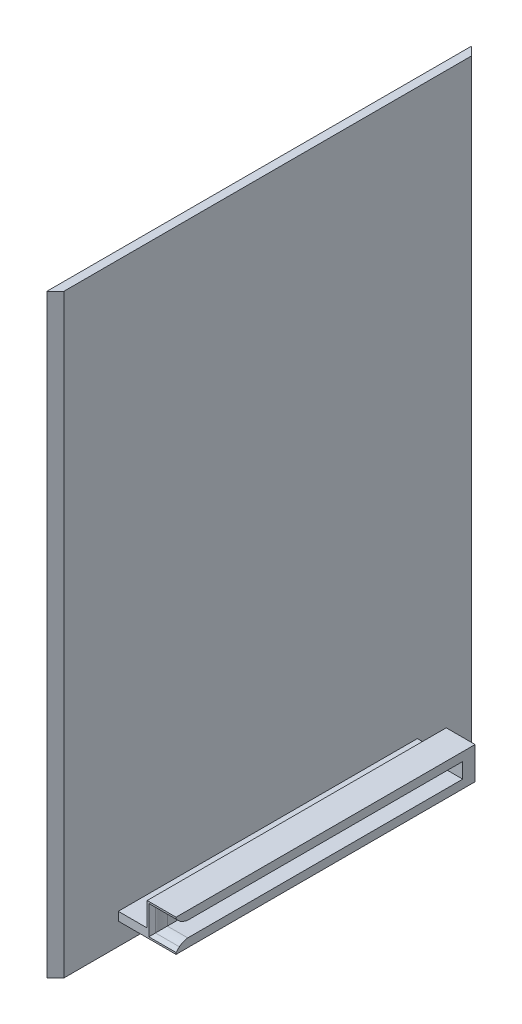
ISO-10303-21;
HEADER;
FILE_DESCRIPTION(('STEP AP214'),'2;1');
FILE_NAME('part.step','',(''),(''),'','','');
FILE_SCHEMA(('AUTOMOTIVE_DESIGN { 1 0 10303 214 1 1 1 1 }'));
ENDSEC;
DATA;
#1=APPLICATION_CONTEXT('core data for automotive mechanical design processes');
#2=APPLICATION_PROTOCOL_DEFINITION('international standard','automotive_design',2000,#1);
#3=PRODUCT_CONTEXT('',#1,'mechanical');
#4=PRODUCT('Part','Part','',(#3));
#5=PRODUCT_RELATED_PRODUCT_CATEGORY('part','',(#4));
#6=PRODUCT_DEFINITION_FORMATION('','',#4);
#7=PRODUCT_DEFINITION_CONTEXT('part definition',#1,'design');
#8=PRODUCT_DEFINITION('design','',#6,#7);
#9=PRODUCT_DEFINITION_SHAPE('','',#8);
#10=(LENGTH_UNIT() NAMED_UNIT(*) SI_UNIT(.MILLI.,.METRE.));
#11=(NAMED_UNIT(*) PLANE_ANGLE_UNIT() SI_UNIT($,.RADIAN.));
#12=(NAMED_UNIT(*) SI_UNIT($,.STERADIAN.) SOLID_ANGLE_UNIT());
#13=UNCERTAINTY_MEASURE_WITH_UNIT(LENGTH_MEASURE(1.E-05),#10,'distance_accuracy_value','');
#14=(GEOMETRIC_REPRESENTATION_CONTEXT(3) GLOBAL_UNCERTAINTY_ASSIGNED_CONTEXT((#13)) GLOBAL_UNIT_ASSIGNED_CONTEXT((#10,
#11,#12)) REPRESENTATION_CONTEXT('',''));
#15=CARTESIAN_POINT('',(0.,0.,0.));
#16=DIRECTION('',(0.,0.,1.));
#17=DIRECTION('',(1.,0.,0.));
#18=AXIS2_PLACEMENT_3D('',#15,#16,#17);
#19=CARTESIAN_POINT('',(34.,18.,-37.));
#20=DIRECTION('',(0.,-1.,0.));
#21=DIRECTION('',(0.,0.,-1.));
#22=AXIS2_PLACEMENT_3D('',#19,#20,#21);
#23=PLANE('',#22);
#24=DIRECTION('',(1.,0.,0.));
#25=VECTOR('',#24,1.);
#26=CARTESIAN_POINT('',(34.,18.,-205.7));
#27=LINE('',#26,#25);
#28=CARTESIAN_POINT('',(22.,18.,-205.7));
#29=VERTEX_POINT('',#28);
#30=CARTESIAN_POINT('',(34.,18.,-205.7));
#31=VERTEX_POINT('',#30);
#32=EDGE_CURVE('E73',#29,#31,#27,.T.);
#33=ORIENTED_EDGE('',*,*,#32,.F.);
#34=DIRECTION('',(0.,0.,-1.));
#35=VECTOR('',#34,1.);
#36=CARTESIAN_POINT('',(22.,18.,-213.));
#37=LINE('',#36,#35);
#38=CARTESIAN_POINT('',(22.,18.,-43.8994949366117));
#39=VERTEX_POINT('',#38);
#40=EDGE_CURVE('E189',#39,#29,#37,.T.);
#41=ORIENTED_EDGE('',*,*,#40,.F.);
#42=CARTESIAN_POINT('',(34.7025126265847,18.,-43.8994949366117));
#43=CARTESIAN_POINT('',(29.5507533649635,18.,-43.8994949366117));
#44=CARTESIAN_POINT('',(24.3989941033423,18.,-43.8994949366117));
#45=CARTESIAN_POINT('',(19.2472348417211,18.,-43.8994949366117));
#46=(BOUNDED_CURVE() B_SPLINE_CURVE(3,(#42,#43,#44,#45),.UNSPECIFIED.,.F.,
.F.) B_SPLINE_CURVE_WITH_KNOTS((4,4),(-0.0147527651582789,0.000702512626584707),
.UNSPECIFIED.) CURVE() GEOMETRIC_REPRESENTATION_ITEM() RATIONAL_B_SPLINE_CURVE((1.,1.,1.,1.)) REPRESENTATION_ITEM(''));
#47=CARTESIAN_POINT('',(34.,18.,-43.8994949366117));
#48=VERTEX_POINT('',#47);
#49=EDGE_CURVE('E406',#39,#48,#46,.F.);
#50=ORIENTED_EDGE('',*,*,#49,.T.);
#51=DIRECTION('',(0.,0.,1.));
#52=VECTOR('',#51,1.);
#53=CARTESIAN_POINT('',(34.,18.,-37.));
#54=LINE('',#53,#52);
#55=EDGE_CURVE('E68',#31,#48,#54,.T.);
#56=ORIENTED_EDGE('',*,*,#55,.F.);
#57=EDGE_LOOP('',(#33,#41,#50,#56));
#58=FACE_BOUND('',#57,.T.);
#59=ADVANCED_FACE('F46',(#58),#23,.F.);
#60=CARTESIAN_POINT('',(22.,27.,-213.));
#61=DIRECTION('',(-1.,0.,0.));
#62=DIRECTION('',(0.,0.,1.));
#63=AXIS2_PLACEMENT_3D('',#60,#61,#62);
#64=PLANE('',#63);
#65=DIRECTION('',(0.,-1.,0.));
#66=VECTOR('',#65,1.);
#67=CARTESIAN_POINT('',(22.,27.,-205.7));
#68=LINE('',#67,#66);
#69=CARTESIAN_POINT('',(22.,27.,-205.7));
#70=VERTEX_POINT('',#69);
#71=EDGE_CURVE('E192',#70,#29,#68,.T.);
#72=ORIENTED_EDGE('',*,*,#71,.F.);
#73=DIRECTION('',(0.,0.,-1.));
#74=VECTOR('',#73,1.);
#75=CARTESIAN_POINT('',(22.,27.,-213.));
#76=LINE('',#75,#74);
#77=CARTESIAN_POINT('',(22.,27.,-43.8994949366117));
#78=VERTEX_POINT('',#77);
#79=EDGE_CURVE('E176',#78,#70,#76,.T.);
#80=ORIENTED_EDGE('',*,*,#79,.F.);
#81=CARTESIAN_POINT('',(22.,15.2947222151364,-43.8994949366117));
#82=CARTESIAN_POINT('',(22.,20.0982407383788,-43.8994949366117));
#83=CARTESIAN_POINT('',(22.,24.9017592616213,-43.8994949366117));
#84=CARTESIAN_POINT('',(22.,29.7052777848636,-43.8994949366117));
#85=(BOUNDED_CURVE() B_SPLINE_CURVE(3,(#81,#82,#83,#84),.UNSPECIFIED.,.F.,
.F.) B_SPLINE_CURVE_WITH_KNOTS((4,4),(-0.00270527778486359,0.0117052777848636),
.UNSPECIFIED.) CURVE() GEOMETRIC_REPRESENTATION_ITEM() RATIONAL_B_SPLINE_CURVE((1.,1.,1.,1.)) REPRESENTATION_ITEM(''));
#86=EDGE_CURVE('E339',#78,#39,#85,.F.);
#87=ORIENTED_EDGE('',*,*,#86,.T.);
#88=ORIENTED_EDGE('',*,*,#40,.T.);
#89=EDGE_LOOP('',(#72,#80,#87,#88));
#90=FACE_BOUND('',#89,.T.);
#91=ADVANCED_FACE('F193',(#90),#64,.F.);
#92=CARTESIAN_POINT('',(0.,27.,0.));
#93=DIRECTION('',(0.,1.,0.));
#94=DIRECTION('',(0.,0.,1.));
#95=AXIS2_PLACEMENT_3D('',#92,#93,#94);
#96=PLANE('',#95);
#97=DIRECTION('',(-1.,0.,0.));
#98=VECTOR('',#97,1.);
#99=CARTESIAN_POINT('',(0.,27.,-205.7));
#100=LINE('',#99,#98);
#101=CARTESIAN_POINT('',(34.,27.,-205.7));
#102=VERTEX_POINT('',#101);
#103=EDGE_CURVE('E181',#102,#70,#100,.T.);
#104=ORIENTED_EDGE('',*,*,#103,.F.);
#105=DIRECTION('',(0.,0.,-1.));
#106=VECTOR('',#105,1.);
#107=CARTESIAN_POINT('',(34.,27.,-213.));
#108=LINE('',#107,#106);
#109=CARTESIAN_POINT('',(34.,27.,-43.8994949366117));
#110=VERTEX_POINT('',#109);
#111=EDGE_CURVE('E208',#110,#102,#108,.T.);
#112=ORIENTED_EDGE('',*,*,#111,.F.);
#113=CARTESIAN_POINT('',(19.2472348417212,27.,-43.8994949366117));
#114=CARTESIAN_POINT('',(24.3989941033424,27.,-43.8994949366117));
#115=CARTESIAN_POINT('',(29.5507533649635,27.,-43.8994949366117));
#116=CARTESIAN_POINT('',(34.7025126265847,27.,-43.8994949366117));
#117=(BOUNDED_CURVE() B_SPLINE_CURVE(3,(#113,#114,#115,#116),.UNSPECIFIED.,.F.,
.F.) B_SPLINE_CURVE_WITH_KNOTS((4,4),(-0.0347025126265847,-0.0192472348417212),
.UNSPECIFIED.) CURVE() GEOMETRIC_REPRESENTATION_ITEM() RATIONAL_B_SPLINE_CURVE((1.,1.,1.,1.)) REPRESENTATION_ITEM(''));
#118=EDGE_CURVE('E184',#110,#78,#117,.F.);
#119=ORIENTED_EDGE('',*,*,#118,.T.);
#120=ORIENTED_EDGE('',*,*,#79,.T.);
#121=EDGE_LOOP('',(#104,#112,#119,#120));
#122=FACE_BOUND('',#121,.T.);
#123=ADVANCED_FACE('F178',(#122),#96,.F.);
#124=DIRECTION('',(0.,0.,1.));
#125=VECTOR('',#124,1.);
#126=CARTESIAN_POINT('',(17.,18.,-213.));
#127=LINE('',#126,#125);
#128=CARTESIAN_POINT('',(17.,18.,-213.));
#129=VERTEX_POINT('',#128);
#130=CARTESIAN_POINT('',(17.,18.,-37.));
#131=VERTEX_POINT('',#130);
#132=EDGE_CURVE('E269',#129,#131,#127,.T.);
#133=ORIENTED_EDGE('',*,*,#132,.F.);
#134=DIRECTION('',(-1.,0.,0.));
#135=VECTOR('',#134,1.);
#136=CARTESIAN_POINT('',(34.,18.,-213.));
#137=LINE('',#136,#135);
#138=CARTESIAN_POINT('',(0.,18.,-213.));
#139=VERTEX_POINT('',#138);
#140=EDGE_CURVE('E463',#129,#139,#137,.T.);
#141=ORIENTED_EDGE('',*,*,#140,.T.);
#142=DIRECTION('',(0.,0.,1.));
#143=VECTOR('',#142,1.);
#144=CARTESIAN_POINT('',(0.,18.,-37.));
#145=LINE('',#144,#143);
#146=CARTESIAN_POINT('',(0.,18.,-37.));
#147=VERTEX_POINT('',#146);
#148=EDGE_CURVE('E283',#139,#147,#145,.T.);
#149=ORIENTED_EDGE('',*,*,#148,.T.);
#150=DIRECTION('',(-1.,0.,0.));
#151=VECTOR('',#150,1.);
#152=CARTESIAN_POINT('',(34.,18.,-37.));
#153=LINE('',#152,#151);
#154=EDGE_CURVE('E292',#131,#147,#153,.T.);
#155=ORIENTED_EDGE('',*,*,#154,.F.);
#156=EDGE_LOOP('',(#133,#141,#149,#155));
#157=FACE_BOUND('',#156,.T.);
#158=ADVANCED_FACE('F244',(#157),#23,.F.);
#159=CARTESIAN_POINT('',(0.,350.,0.));
#160=DIRECTION('',(-1.,0.,0.));
#161=DIRECTION('',(0.,0.,1.));
#162=AXIS2_PLACEMENT_3D('',#159,#160,#161);
#163=PLANE('',#162);
#164=DIRECTION('',(0.,0.,-1.));
#165=VECTOR('',#164,1.);
#166=CARTESIAN_POINT('',(0.,0.,0.));
#167=LINE('',#166,#165);
#168=CARTESIAN_POINT('',(0.,0.,-5.));
#169=VERTEX_POINT('',#168);
#170=CARTESIAN_POINT('',(0.,0.,-245.));
#171=VERTEX_POINT('',#170);
#172=EDGE_CURVE('E437',#169,#171,#167,.T.);
#173=ORIENTED_EDGE('',*,*,#172,.T.);
#174=DIRECTION('',(0.,1.,0.));
#175=VECTOR('',#174,1.);
#176=CARTESIAN_POINT('',(0.,-0.000999999999973245,-245.));
#177=LINE('',#176,#175);
#178=CARTESIAN_POINT('',(0.,350.,-245.));
#179=VERTEX_POINT('',#178);
#180=EDGE_CURVE('E454',#171,#179,#177,.T.);
#181=ORIENTED_EDGE('',*,*,#180,.T.);
#182=DIRECTION('',(0.,0.,-1.));
#183=VECTOR('',#182,1.);
#184=CARTESIAN_POINT('',(0.,350.,0.));
#185=LINE('',#184,#183);
#186=CARTESIAN_POINT('',(0.,350.,-5.));
#187=VERTEX_POINT('',#186);
#188=EDGE_CURVE('E436',#187,#179,#185,.T.);
#189=ORIENTED_EDGE('',*,*,#188,.F.);
#190=DIRECTION('',(0.,1.,0.));
#191=VECTOR('',#190,1.);
#192=CARTESIAN_POINT('',(0.,-0.000999999999973245,-5.));
#193=LINE('',#192,#191);
#194=EDGE_CURVE('E445',#169,#187,#193,.T.);
#195=ORIENTED_EDGE('',*,*,#194,.F.);
#196=EDGE_LOOP('',(#173,#181,#189,#195));
#197=FACE_BOUND('',#196,.T.);
#198=DIRECTION('',(0.,-1.,0.));
#199=VECTOR('',#198,1.);
#200=CARTESIAN_POINT('',(0.,13.,-37.));
#201=LINE('',#200,#199);
#202=CARTESIAN_POINT('',(0.,13.,-37.));
#203=VERTEX_POINT('',#202);
#204=EDGE_CURVE('E279',#147,#203,#201,.T.);
#205=ORIENTED_EDGE('',*,*,#204,.F.);
#206=ORIENTED_EDGE('',*,*,#148,.F.);
#207=DIRECTION('',(0.,1.,0.));
#208=VECTOR('',#207,1.);
#209=CARTESIAN_POINT('',(0.,13.,-213.));
#210=LINE('',#209,#208);
#211=CARTESIAN_POINT('',(0.,13.,-213.));
#212=VERTEX_POINT('',#211);
#213=EDGE_CURVE('E468',#212,#139,#210,.T.);
#214=ORIENTED_EDGE('',*,*,#213,.F.);
#215=DIRECTION('',(0.,0.,-1.));
#216=VECTOR('',#215,1.);
#217=CARTESIAN_POINT('',(0.,13.,-37.));
#218=LINE('',#217,#216);
#219=EDGE_CURVE('E470',#203,#212,#218,.T.);
#220=ORIENTED_EDGE('',*,*,#219,.F.);
#221=EDGE_LOOP('',(#205,#206,#214,#220));
#222=FACE_BOUND('',#221,.T.);
#223=ADVANCED_FACE('F481',(#197,#222),#163,.F.);
#224=CARTESIAN_POINT('',(-5.,350.,-250.));
#225=DIRECTION('',(1.,0.,0.));
#226=DIRECTION('',(0.,0.,-1.));
#227=AXIS2_PLACEMENT_3D('',#224,#225,#226);
#228=PLANE('',#227);
#229=DIRECTION('',(0.,0.,1.));
#230=VECTOR('',#229,1.);
#231=CARTESIAN_POINT('',(-5.,0.,-250.));
#232=LINE('',#231,#230);
#233=CARTESIAN_POINT('',(-5.,0.,-250.));
#234=VERTEX_POINT('',#233);
#235=CARTESIAN_POINT('',(-4.99999999999997,0.,0.));
#236=VERTEX_POINT('',#235);
#237=EDGE_CURVE('E433',#234,#236,#232,.T.);
#238=ORIENTED_EDGE('',*,*,#237,.T.);
#239=DIRECTION('',(0.,-1.,0.));
#240=VECTOR('',#239,1.);
#241=CARTESIAN_POINT('',(-4.99999999999997,350.,0.));
#242=LINE('',#241,#240);
#243=CARTESIAN_POINT('',(-4.99999999999997,350.,0.));
#244=VERTEX_POINT('',#243);
#245=EDGE_CURVE('E430',#244,#236,#242,.T.);
#246=ORIENTED_EDGE('',*,*,#245,.F.);
#247=DIRECTION('',(0.,0.,1.));
#248=VECTOR('',#247,1.);
#249=CARTESIAN_POINT('',(-5.,350.,-250.));
#250=LINE('',#249,#248);
#251=CARTESIAN_POINT('',(-5.,350.,-250.));
#252=VERTEX_POINT('',#251);
#253=EDGE_CURVE('E432',#252,#244,#250,.T.);
#254=ORIENTED_EDGE('',*,*,#253,.F.);
#255=DIRECTION('',(0.,-1.,0.));
#256=VECTOR('',#255,1.);
#257=CARTESIAN_POINT('',(-5.,350.,-250.));
#258=LINE('',#257,#256);
#259=EDGE_CURVE('E427',#252,#234,#258,.T.);
#260=ORIENTED_EDGE('',*,*,#259,.T.);
#261=EDGE_LOOP('',(#238,#246,#254,#260));
#262=FACE_BOUND('',#261,.T.);
#263=ADVANCED_FACE('F522',(#262),#228,.F.);
#264=CARTESIAN_POINT('',(0.,350.,0.));
#265=DIRECTION('',(0.,1.,0.));
#266=DIRECTION('',(0.,0.,1.));
#267=AXIS2_PLACEMENT_3D('',#264,#265,#266);
#268=PLANE('',#267);
#269=DIRECTION('',(0.707106781186547,0.,0.707106781186548));
#270=VECTOR('',#269,1.);
#271=CARTESIAN_POINT('',(0.,350.,-245.));
#272=LINE('',#271,#270);
#273=EDGE_CURVE('E447',#252,#179,#272,.T.);
#274=ORIENTED_EDGE('',*,*,#273,.F.);
#275=ORIENTED_EDGE('',*,*,#253,.T.);
#276=DIRECTION('',(-0.707106781186545,0.,0.70710678118655));
#277=VECTOR('',#276,1.);
#278=CARTESIAN_POINT('',(-4.99999999999997,350.,0.));
#279=LINE('',#278,#277);
#280=EDGE_CURVE('E448',#187,#244,#279,.T.);
#281=ORIENTED_EDGE('',*,*,#280,.F.);
#282=ORIENTED_EDGE('',*,*,#188,.T.);
#283=EDGE_LOOP('',(#274,#275,#281,#282));
#284=FACE_BOUND('',#283,.T.);
#285=ADVANCED_FACE('F529',(#284),#268,.T.);
#286=CARTESIAN_POINT('',(0.,0.,0.));
#287=DIRECTION('',(0.,1.,0.));
#288=DIRECTION('',(0.,0.,1.));
#289=AXIS2_PLACEMENT_3D('',#286,#287,#288);
#290=PLANE('',#289);
#291=ORIENTED_EDGE('',*,*,#237,.F.);
#292=DIRECTION('',(-0.707106781186547,0.,-0.707106781186548));
#293=VECTOR('',#292,1.);
#294=CARTESIAN_POINT('',(0.,0.,-245.));
#295=LINE('',#294,#293);
#296=EDGE_CURVE('E440',#171,#234,#295,.T.);
#297=ORIENTED_EDGE('',*,*,#296,.F.);
#298=ORIENTED_EDGE('',*,*,#172,.F.);
#299=DIRECTION('',(0.707106781186545,0.,-0.70710678118655));
#300=VECTOR('',#299,1.);
#301=CARTESIAN_POINT('',(-4.99999999999997,0.,0.));
#302=LINE('',#301,#300);
#303=EDGE_CURVE('E450',#236,#169,#302,.T.);
#304=ORIENTED_EDGE('',*,*,#303,.F.);
#305=EDGE_LOOP('',(#291,#297,#298,#304));
#306=FACE_BOUND('',#305,.T.);
#307=ADVANCED_FACE('F576',(#306),#290,.F.);
#308=CARTESIAN_POINT('',(-4.99999999999997,-0.000999999999973245,0.));
#309=DIRECTION('',(-0.70710678118655,0.,-0.707106781186545));
#310=DIRECTION('',(-0.707106781186545,0.,0.70710678118655));
#311=AXIS2_PLACEMENT_3D('',#308,#309,#310);
#312=PLANE('',#311);
#313=ORIENTED_EDGE('',*,*,#303,.T.);
#314=ORIENTED_EDGE('',*,*,#194,.T.);
#315=ORIENTED_EDGE('',*,*,#280,.T.);
#316=ORIENTED_EDGE('',*,*,#245,.T.);
#317=EDGE_LOOP('',(#313,#314,#315,#316));
#318=FACE_BOUND('',#317,.T.);
#319=ADVANCED_FACE('F572',(#318),#312,.F.);
#320=CARTESIAN_POINT('',(0.,-0.000999999999973245,-245.));
#321=DIRECTION('',(-0.707106781186548,0.,0.707106781186547));
#322=DIRECTION('',(0.707106781186547,0.,0.707106781186548));
#323=AXIS2_PLACEMENT_3D('',#320,#321,#322);
#324=PLANE('',#323);
#325=ORIENTED_EDGE('',*,*,#296,.T.);
#326=ORIENTED_EDGE('',*,*,#259,.F.);
#327=ORIENTED_EDGE('',*,*,#273,.T.);
#328=ORIENTED_EDGE('',*,*,#180,.F.);
#329=EDGE_LOOP('',(#325,#326,#327,#328));
#330=FACE_BOUND('',#329,.T.);
#331=ADVANCED_FACE('F570',(#330),#324,.F.);
#332=CARTESIAN_POINT('',(34.,13.,-37.));
#333=DIRECTION('',(0.,0.,-1.));
#334=DIRECTION('',(-1.,0.,0.));
#335=AXIS2_PLACEMENT_3D('',#332,#333,#334);
#336=PLANE('',#335);
#337=DIRECTION('',(0.,-1.,0.));
#338=VECTOR('',#337,1.);
#339=CARTESIAN_POINT('',(34.,13.,-37.));
#340=LINE('',#339,#338);
#341=CARTESIAN_POINT('',(34.,14.,-37.));
#342=VERTEX_POINT('',#341);
#343=CARTESIAN_POINT('',(34.,13.,-37.));
#344=VERTEX_POINT('',#343);
#345=EDGE_CURVE('E280',#342,#344,#340,.T.);
#346=ORIENTED_EDGE('',*,*,#345,.F.);
#347=DIRECTION('',(-1.,0.,0.));
#348=VECTOR('',#347,1.);
#349=CARTESIAN_POINT('',(34.,14.,-37.));
#350=LINE('',#349,#348);
#351=CARTESIAN_POINT('',(18.,14.,-37.));
#352=VERTEX_POINT('',#351);
#353=EDGE_CURVE('E409',#342,#352,#350,.T.);
#354=ORIENTED_EDGE('',*,*,#353,.T.);
#355=DIRECTION('',(0.,1.,0.));
#356=VECTOR('',#355,1.);
#357=CARTESIAN_POINT('',(18.,13.,-37.));
#358=LINE('',#357,#356);
#359=CARTESIAN_POINT('',(18.,31.,-37.));
#360=VERTEX_POINT('',#359);
#361=EDGE_CURVE('E413',#352,#360,#358,.T.);
#362=ORIENTED_EDGE('',*,*,#361,.T.);
#363=DIRECTION('',(1.,0.,0.));
#364=VECTOR('',#363,1.);
#365=CARTESIAN_POINT('',(34.,31.,-37.));
#366=LINE('',#365,#364);
#367=CARTESIAN_POINT('',(34.,31.,-37.));
#368=VERTEX_POINT('',#367);
#369=EDGE_CURVE('E425',#360,#368,#366,.T.);
#370=ORIENTED_EDGE('',*,*,#369,.T.);
#371=DIRECTION('',(0.,-1.,0.));
#372=VECTOR('',#371,1.);
#373=CARTESIAN_POINT('',(34.,32.,-37.));
#374=LINE('',#373,#372);
#375=CARTESIAN_POINT('',(34.,32.,-37.));
#376=VERTEX_POINT('',#375);
#377=EDGE_CURVE('E216',#376,#368,#374,.T.);
#378=ORIENTED_EDGE('',*,*,#377,.F.);
#379=DIRECTION('',(1.,0.,0.));
#380=VECTOR('',#379,1.);
#381=CARTESIAN_POINT('',(17.,32.,-37.));
#382=LINE('',#381,#380);
#383=CARTESIAN_POINT('',(17.,32.,-37.));
#384=VERTEX_POINT('',#383);
#385=EDGE_CURVE('E207',#384,#376,#382,.T.);
#386=ORIENTED_EDGE('',*,*,#385,.F.);
#387=DIRECTION('',(0.,-1.,0.));
#388=VECTOR('',#387,1.);
#389=CARTESIAN_POINT('',(17.,27.,-37.));
#390=LINE('',#389,#388);
#391=EDGE_CURVE('E276',#384,#131,#390,.T.);
#392=ORIENTED_EDGE('',*,*,#391,.T.);
#393=ORIENTED_EDGE('',*,*,#154,.T.);
#394=ORIENTED_EDGE('',*,*,#204,.T.);
#395=DIRECTION('',(-1.,0.,0.));
#396=VECTOR('',#395,1.);
#397=CARTESIAN_POINT('',(34.,13.,-37.));
#398=LINE('',#397,#396);
#399=EDGE_CURVE('E452',#344,#203,#398,.T.);
#400=ORIENTED_EDGE('',*,*,#399,.F.);
#401=EDGE_LOOP('',(#346,#354,#362,#370,#378,#386,#392,#393,#394,#400));
#402=FACE_BOUND('',#401,.T.);
#403=ADVANCED_FACE('F478',(#402),#336,.F.);
#404=CARTESIAN_POINT('',(34.,13.,-37.));
#405=DIRECTION('',(0.,1.,0.));
#406=DIRECTION('',(0.,0.,1.));
#407=AXIS2_PLACEMENT_3D('',#404,#405,#406);
#408=PLANE('',#407);
#409=ORIENTED_EDGE('',*,*,#219,.T.);
#410=DIRECTION('',(-1.,0.,0.));
#411=VECTOR('',#410,1.);
#412=CARTESIAN_POINT('',(34.,13.,-213.));
#413=LINE('',#412,#411);
#414=CARTESIAN_POINT('',(34.,13.,-213.));
#415=VERTEX_POINT('',#414);
#416=EDGE_CURVE('E460',#415,#212,#413,.T.);
#417=ORIENTED_EDGE('',*,*,#416,.F.);
#418=DIRECTION('',(0.,0.,-1.));
#419=VECTOR('',#418,1.);
#420=CARTESIAN_POINT('',(34.,13.,-37.));
#421=LINE('',#420,#419);
#422=EDGE_CURVE('E282',#344,#415,#421,.T.);
#423=ORIENTED_EDGE('',*,*,#422,.F.);
#424=ORIENTED_EDGE('',*,*,#399,.T.);
#425=EDGE_LOOP('',(#409,#417,#423,#424));
#426=FACE_BOUND('',#425,.T.);
#427=ADVANCED_FACE('F490',(#426),#408,.F.);
#428=CARTESIAN_POINT('',(34.,13.,-213.));
#429=DIRECTION('',(0.,0.,1.));
#430=DIRECTION('',(1.,0.,0.));
#431=AXIS2_PLACEMENT_3D('',#428,#429,#430);
#432=PLANE('',#431);
#433=DIRECTION('',(-1.,0.,0.));
#434=VECTOR('',#433,1.);
#435=CARTESIAN_POINT('',(17.,32.,-213.));
#436=LINE('',#435,#434);
#437=CARTESIAN_POINT('',(34.,32.,-213.));
#438=VERTEX_POINT('',#437);
#439=CARTESIAN_POINT('',(17.,32.,-213.));
#440=VERTEX_POINT('',#439);
#441=EDGE_CURVE('E213',#438,#440,#436,.T.);
#442=ORIENTED_EDGE('',*,*,#441,.F.);
#443=DIRECTION('',(0.,1.,0.));
#444=VECTOR('',#443,1.);
#445=CARTESIAN_POINT('',(34.,13.,-213.));
#446=LINE('',#445,#444);
#447=EDGE_CURVE('E285',#415,#438,#446,.T.);
#448=ORIENTED_EDGE('',*,*,#447,.F.);
#449=ORIENTED_EDGE('',*,*,#416,.T.);
#450=ORIENTED_EDGE('',*,*,#213,.T.);
#451=ORIENTED_EDGE('',*,*,#140,.F.);
#452=DIRECTION('',(0.,-1.,0.));
#453=VECTOR('',#452,1.);
#454=CARTESIAN_POINT('',(17.,27.,-213.));
#455=LINE('',#454,#453);
#456=EDGE_CURVE('E188',#440,#129,#455,.T.);
#457=ORIENTED_EDGE('',*,*,#456,.F.);
#458=EDGE_LOOP('',(#442,#448,#449,#450,#451,#457));
#459=FACE_BOUND('',#458,.T.);
#460=ADVANCED_FACE('F487',(#459),#432,.F.);
#461=CARTESIAN_POINT('',(34.,0.,0.));
#462=DIRECTION('',(-1.,0.,0.));
#463=DIRECTION('',(0.,0.,1.));
#464=AXIS2_PLACEMENT_3D('',#461,#462,#463);
#465=PLANE('',#464);
#466=ORIENTED_EDGE('',*,*,#447,.T.);
#467=DIRECTION('',(0.,0.,-1.));
#468=VECTOR('',#467,1.);
#469=CARTESIAN_POINT('',(34.,32.,-213.));
#470=LINE('',#469,#468);
#471=EDGE_CURVE('E210',#376,#438,#470,.T.);
#472=ORIENTED_EDGE('',*,*,#471,.F.);
#473=ORIENTED_EDGE('',*,*,#377,.T.);
#474=DIRECTION('',(0.,0.707106781186548,0.707106781186548));
#475=VECTOR('',#474,1.);
#476=CARTESIAN_POINT('',(34.,31.,-37.));
#477=LINE('',#476,#475);
#478=CARTESIAN_POINT('',(34.,29.0502525316942,-38.9497474683058));
#479=VERTEX_POINT('',#478);
#480=EDGE_CURVE('E232',#368,#479,#477,.F.);
#481=ORIENTED_EDGE('',*,*,#480,.T.);
#482=CARTESIAN_POINT('',(34.,27.,-43.8994949366117));
#483=CARTESIAN_POINT('',(34.,27.,-41.));
#484=CARTESIAN_POINT('',(34.,29.0502525316942,-38.9497474683058));
#485=(BOUNDED_CURVE() B_SPLINE_CURVE(2,(#482,#483,#484),.UNSPECIFIED.,.F.,
.F.) B_SPLINE_CURVE_WITH_KNOTS((3,3),(0.,1.),
.UNSPECIFIED.) CURVE() GEOMETRIC_REPRESENTATION_ITEM() RATIONAL_B_SPLINE_CURVE((1.,
0.428571428571429,1.)) REPRESENTATION_ITEM(''));
#486=EDGE_CURVE('E12',#479,#110,#485,.F.);
#487=ORIENTED_EDGE('',*,*,#486,.T.);
#488=ORIENTED_EDGE('',*,*,#111,.T.);
#489=DIRECTION('',(0.,-1.,0.));
#490=VECTOR('',#489,1.);
#491=CARTESIAN_POINT('',(34.,28.,-205.7));
#492=LINE('',#491,#490);
#493=EDGE_CURVE('E199',#102,#31,#492,.T.);
#494=ORIENTED_EDGE('',*,*,#493,.T.);
#495=ORIENTED_EDGE('',*,*,#55,.T.);
#496=CARTESIAN_POINT('',(34.,15.9497474683058,-38.9497474683058));
#497=CARTESIAN_POINT('',(34.,18.,-41.));
#498=CARTESIAN_POINT('',(34.,18.,-43.8994949366117));
#499=(BOUNDED_CURVE() B_SPLINE_CURVE(2,(#496,#497,#498),.UNSPECIFIED.,.F.,
.F.) B_SPLINE_CURVE_WITH_KNOTS((3,3),(0.,1.),
.UNSPECIFIED.) CURVE() GEOMETRIC_REPRESENTATION_ITEM() RATIONAL_B_SPLINE_CURVE((1.,
0.428571428571429,1.)) REPRESENTATION_ITEM(''));
#500=CARTESIAN_POINT('',(34.,15.9497474683058,-38.9497474683058));
#501=VERTEX_POINT('',#500);
#502=EDGE_CURVE('E399',#48,#501,#499,.F.);
#503=ORIENTED_EDGE('',*,*,#502,.T.);
#504=DIRECTION('',(0.,0.707106781186548,-0.707106781186548));
#505=VECTOR('',#504,1.);
#506=CARTESIAN_POINT('',(34.,14.,-37.));
#507=LINE('',#506,#505);
#508=EDGE_CURVE('E408',#501,#342,#507,.F.);
#509=ORIENTED_EDGE('',*,*,#508,.T.);
#510=ORIENTED_EDGE('',*,*,#345,.T.);
#511=ORIENTED_EDGE('',*,*,#422,.T.);
#512=EDGE_LOOP('',(#466,#472,#473,#481,#487,#488,#494,#495,#503,#509,#510,#511));
#513=FACE_BOUND('',#512,.T.);
#514=ADVANCED_FACE('F299',(#513),#465,.F.);
#515=CARTESIAN_POINT('',(17.,27.,-213.));
#516=DIRECTION('',(1.,0.,0.));
#517=DIRECTION('',(0.,0.,-1.));
#518=AXIS2_PLACEMENT_3D('',#515,#516,#517);
#519=PLANE('',#518);
#520=ORIENTED_EDGE('',*,*,#132,.T.);
#521=ORIENTED_EDGE('',*,*,#391,.F.);
#522=DIRECTION('',(0.,0.,1.));
#523=VECTOR('',#522,1.);
#524=CARTESIAN_POINT('',(17.,32.,-213.));
#525=LINE('',#524,#523);
#526=EDGE_CURVE('E204',#440,#384,#525,.T.);
#527=ORIENTED_EDGE('',*,*,#526,.F.);
#528=ORIENTED_EDGE('',*,*,#456,.T.);
#529=EDGE_LOOP('',(#520,#521,#527,#528));
#530=FACE_BOUND('',#529,.T.);
#531=ADVANCED_FACE('F250',(#530),#519,.F.);
#532=CARTESIAN_POINT('',(0.,32.,0.));
#533=DIRECTION('',(0.,1.,0.));
#534=DIRECTION('',(0.,0.,1.));
#535=AXIS2_PLACEMENT_3D('',#532,#533,#534);
#536=PLANE('',#535);
#537=ORIENTED_EDGE('',*,*,#526,.T.);
#538=ORIENTED_EDGE('',*,*,#385,.T.);
#539=ORIENTED_EDGE('',*,*,#471,.T.);
#540=ORIENTED_EDGE('',*,*,#441,.T.);
#541=EDGE_LOOP('',(#537,#538,#539,#540));
#542=FACE_BOUND('',#541,.T.);
#543=ADVANCED_FACE('F245',(#542),#536,.T.);
#544=CARTESIAN_POINT('',(34.,31.,-37.));
#545=DIRECTION('',(0.,0.707106781186547,-0.707106781186547));
#546=DIRECTION('',(1.,0.,0.));
#547=AXIS2_PLACEMENT_3D('',#544,#545,#546);
#548=PLANE('',#547);
#549=DIRECTION('',(0.577350269189625,-0.577350269189626,-0.577350269189626));
#550=VECTOR('',#549,1.);
#551=CARTESIAN_POINT('',(22.,27.,-41.));
#552=LINE('',#551,#550);
#553=CARTESIAN_POINT('',(19.9497474683059,29.0502525316942,-38.9497474683058));
#554=VERTEX_POINT('',#553);
#555=EDGE_CURVE('E222',#554,#360,#552,.F.);
#556=ORIENTED_EDGE('',*,*,#555,.F.);
#557=CARTESIAN_POINT('',(34.7025126265847,29.0502525316942,-38.9497474683058));
#558=CARTESIAN_POINT('',(29.5507533649635,29.0502525316942,-38.9497474683058));
#559=CARTESIAN_POINT('',(24.3989941033424,29.0502525316942,-38.9497474683058));
#560=CARTESIAN_POINT('',(19.2472348417212,29.0502525316942,-38.9497474683058));
#561=(BOUNDED_CURVE() B_SPLINE_CURVE(3,(#557,#558,#559,#560),.UNSPECIFIED.,.F.,
.F.) B_SPLINE_CURVE_WITH_KNOTS((4,4),(-0.0347025126265847,-0.0192472348417212),
.UNSPECIFIED.) CURVE() GEOMETRIC_REPRESENTATION_ITEM() RATIONAL_B_SPLINE_CURVE((1.,1.,1.,1.)) REPRESENTATION_ITEM(''));
#562=EDGE_CURVE('E61',#554,#479,#561,.F.);
#563=ORIENTED_EDGE('',*,*,#562,.T.);
#564=ORIENTED_EDGE('',*,*,#480,.F.);
#565=ORIENTED_EDGE('',*,*,#369,.F.);
#566=EDGE_LOOP('',(#556,#563,#564,#565));
#567=FACE_BOUND('',#566,.T.);
#568=ADVANCED_FACE('F500',(#567),#548,.F.);
#569=CARTESIAN_POINT('',(22.,27.,-41.));
#570=DIRECTION('',(-0.707106781186548,0.,-0.707106781186547));
#571=DIRECTION('',(0.,-1.,0.));
#572=AXIS2_PLACEMENT_3D('',#569,#570,#571);
#573=PLANE('',#572);
#574=DIRECTION('',(0.577350269189625,0.577350269189626,-0.577350269189626));
#575=VECTOR('',#574,1.);
#576=CARTESIAN_POINT('',(23.3333333333333,19.3333333333333,-42.3333333333333));
#577=LINE('',#576,#575);
#578=CARTESIAN_POINT('',(19.9497474683059,15.9497474683059,-38.9497474683058));
#579=VERTEX_POINT('',#578);
#580=EDGE_CURVE('E262',#579,#352,#577,.F.);
#581=ORIENTED_EDGE('',*,*,#580,.F.);
#582=CARTESIAN_POINT('',(19.9497474683059,29.7052777848636,-38.9497474683059));
#583=CARTESIAN_POINT('',(19.9497474683059,24.9017592616213,-38.9497474683059));
#584=CARTESIAN_POINT('',(19.9497474683059,20.0982407383788,-38.9497474683059));
#585=CARTESIAN_POINT('',(19.9497474683059,15.2947222151364,-38.9497474683059));
#586=(BOUNDED_CURVE() B_SPLINE_CURVE(3,(#582,#583,#584,#585),.UNSPECIFIED.,.F.,
.F.) B_SPLINE_CURVE_WITH_KNOTS((4,4),(-0.00270527778486359,0.0117052777848636),
.UNSPECIFIED.) CURVE() GEOMETRIC_REPRESENTATION_ITEM() RATIONAL_B_SPLINE_CURVE((1.,1.,1.,1.)) REPRESENTATION_ITEM(''));
#587=EDGE_CURVE('E310',#579,#554,#586,.F.);
#588=ORIENTED_EDGE('',*,*,#587,.T.);
#589=ORIENTED_EDGE('',*,*,#555,.T.);
#590=ORIENTED_EDGE('',*,*,#361,.F.);
#591=EDGE_LOOP('',(#581,#588,#589,#590));
#592=FACE_BOUND('',#591,.T.);
#593=ADVANCED_FACE('F497',(#592),#573,.F.);
#594=CARTESIAN_POINT('',(34.,14.,-37.));
#595=DIRECTION('',(0.,-0.707106781186547,-0.707106781186547));
#596=DIRECTION('',(-1.,0.,0.));
#597=AXIS2_PLACEMENT_3D('',#594,#595,#596);
#598=PLANE('',#597);
#599=ORIENTED_EDGE('',*,*,#508,.F.);
#600=CARTESIAN_POINT('',(19.2472348417211,15.9497474683058,-38.9497474683058));
#601=CARTESIAN_POINT('',(24.3989941033423,15.9497474683058,-38.9497474683058));
#602=CARTESIAN_POINT('',(29.5507533649635,15.9497474683058,-38.9497474683058));
#603=CARTESIAN_POINT('',(34.7025126265847,15.9497474683058,-38.9497474683058));
#604=(BOUNDED_CURVE() B_SPLINE_CURVE(3,(#600,#601,#602,#603),.UNSPECIFIED.,.F.,
.F.) B_SPLINE_CURVE_WITH_KNOTS((4,4),(-0.0147527651582789,0.000702512626584707),
.UNSPECIFIED.) CURVE() GEOMETRIC_REPRESENTATION_ITEM() RATIONAL_B_SPLINE_CURVE((1.,1.,1.,1.)) REPRESENTATION_ITEM(''));
#605=EDGE_CURVE('E390',#501,#579,#604,.F.);
#606=ORIENTED_EDGE('',*,*,#605,.T.);
#607=ORIENTED_EDGE('',*,*,#580,.T.);
#608=ORIENTED_EDGE('',*,*,#353,.F.);
#609=EDGE_LOOP('',(#599,#606,#607,#608));
#610=FACE_BOUND('',#609,.T.);
#611=ADVANCED_FACE('F493',(#610),#598,.F.);
#612=CARTESIAN_POINT('',(34.7025126265847,27.,-43.8994949366117));
#613=CARTESIAN_POINT('',(29.5507533649635,27.,-43.8994949366117));
#614=CARTESIAN_POINT('',(24.3989941033424,27.,-43.8994949366117));
#615=CARTESIAN_POINT('',(19.2472348417212,27.,-43.8994949366117));
#616=CARTESIAN_POINT('',(34.7025126265847,27.,-41.));
#617=CARTESIAN_POINT('',(29.5507533649635,27.,-41.));
#618=CARTESIAN_POINT('',(24.3989941033423,27.,-41.));
#619=CARTESIAN_POINT('',(19.2472348417212,27.,-41.));
#620=CARTESIAN_POINT('',(34.7025126265847,29.0502525316942,-38.9497474683058));
#621=CARTESIAN_POINT('',(29.5507533649635,29.0502525316942,-38.9497474683058));
#622=CARTESIAN_POINT('',(24.3989941033424,29.0502525316942,-38.9497474683058));
#623=CARTESIAN_POINT('',(19.2472348417212,29.0502525316942,-38.9497474683058));
#624=(BOUNDED_SURFACE() B_SPLINE_SURFACE(2,3,((#612,#613,#614,#615),(#616,#617,#618,#619),(#620,
#621,#622,#623)),.UNSPECIFIED.,.F.,.F.,.F.) B_SPLINE_SURFACE_WITH_KNOTS((3,3),(4,4),(0.,1.),
(-0.0347025126265847,-0.0192472348417212),
.UNSPECIFIED.) GEOMETRIC_REPRESENTATION_ITEM() RATIONAL_B_SPLINE_SURFACE(((1.,1.,1.,1.),
(0.428571428571429,0.428571428571429,0.428571428571429,0.428571428571429),(1.,1.,1.,1.))) REPRESENTATION_ITEM('') SURFACE());
#625=CARTESIAN_POINT('',(22.,26.9999999999999,-43.8994949366117));
#626=CARTESIAN_POINT('',(21.999997344728,27.0000041380448,-43.8846225211692));
#627=CARTESIAN_POINT('',(21.9997797751256,27.0002513128581,-43.869754155258));
#628=CARTESIAN_POINT('',(21.9989416810796,27.0011900064596,-43.8390479758287));
#629=CARTESIAN_POINT('',(21.9982952287335,27.0019100839733,-43.8232116987843));
#630=CARTESIAN_POINT('',(21.9965868726695,27.0037925347981,-43.7905652544836));
#631=CARTESIAN_POINT('',(21.9955009378085,27.0049803604428,-43.7737579102393));
#632=CARTESIAN_POINT('',(21.9928976587924,27.0078030124368,-43.7391665094881));
#633=CARTESIAN_POINT('',(21.9913578574975,27.0094608697565,-43.7213860749096));
#634=CARTESIAN_POINT('',(21.9859232947387,27.0152654429812,-43.6650077944028));
#635=CARTESIAN_POINT('',(21.9813896855281,27.0200450802994,-43.6265364419196));
#636=CARTESIAN_POINT('',(21.9705366934936,27.0313356427373,-43.5457449196312));
#637=CARTESIAN_POINT('',(21.9640763507634,27.0379786420638,-43.5034633023588));
#638=CARTESIAN_POINT('',(21.9492952014189,27.0530249871048,-43.4151766153984));
#639=CARTESIAN_POINT('',(21.9408544064636,27.0615368218007,-43.3692104995079));
#640=CARTESIAN_POINT('',(21.9220721208074,27.0803403210618,-43.273757086755));
#641=CARTESIAN_POINT('',(21.911629509958,27.0907221595803,-43.224307802633));
#642=CARTESIAN_POINT('',(21.8888376711294,27.1132813574165,-43.1221582582028));
#643=CARTESIAN_POINT('',(21.8764040641894,27.1255350682311,-43.069493848812));
#644=CARTESIAN_POINT('',(21.8496583902402,27.1518500803811,-42.9612536819439));
#645=CARTESIAN_POINT('',(21.8352767467481,27.1659771101855,-42.9057113228636));
#646=CARTESIAN_POINT('',(21.7882951661789,27.2121921257295,-42.7311039296985));
#647=CARTESIAN_POINT('',(21.7538938093147,27.2461251844278,-42.6130035131455));
#648=CARTESIAN_POINT('',(21.694992809611,27.304995188874,-42.4222481660878));
#649=CARTESIAN_POINT('',(21.6715101597558,27.3286452245397,-42.3488684546798));
#650=CARTESIAN_POINT('',(21.6207175704096,27.3797714580351,-42.1950394667036));
#651=CARTESIAN_POINT('',(21.5932680896778,27.4073851258163,-42.1146819033448));
#652=CARTESIAN_POINT('',(21.5343721081425,27.4664688379614,-41.9473714260433));
#653=CARTESIAN_POINT('',(21.5027922932396,27.4980575455517,-41.8605075785721));
#654=CARTESIAN_POINT('',(21.4356030357139,27.5650987658724,-41.6810378598));
#655=CARTESIAN_POINT('',(21.3998720517156,27.6006597155971,-41.5885180546544));
#656=CARTESIAN_POINT('',(21.3245314240632,27.6756479294387,-41.3990113368846));
#657=CARTESIAN_POINT('',(21.2848188718724,27.7151779936973,-41.3021058284383));
#658=CARTESIAN_POINT('',(21.2143074886666,27.7856948269074,-41.1349847069136));
#659=CARTESIAN_POINT('',(21.1838903402081,27.8162155958281,-41.0644102068088));
#660=CARTESIAN_POINT('',(21.1148325149951,27.8853470155261,-40.9075277610073));
#661=CARTESIAN_POINT('',(21.0759405816585,27.924171748972,-40.8214241969313));
#662=CARTESIAN_POINT('',(21.0139579818917,27.9860873368661,-40.6877499220108));
#663=CARTESIAN_POINT('',(20.9913564753421,28.0086724319209,-40.6397171947646));
#664=CARTESIAN_POINT('',(20.941302504177,28.0586630478826,-40.5349280579686));
#665=CARTESIAN_POINT('',(20.9137505797074,28.0861627794311,-40.4782641846895));
#666=CARTESIAN_POINT('',(20.8426394054465,28.1571085308518,-40.3346872543707));
#667=CARTESIAN_POINT('',(20.7985944720981,28.2010224564507,-40.2482418151517));
#668=CARTESIAN_POINT('',(20.7248263470281,28.2749770292647,-40.1078652139001));
#669=CARTESIAN_POINT('',(20.6955983900008,28.3043791489417,-40.0533346549391));
#670=CARTESIAN_POINT('',(20.6066189272207,28.3934260153241,-39.8908216837582));
#671=CARTESIAN_POINT('',(20.545597260252,28.4538852664135,-39.7839686025951));
#672=CARTESIAN_POINT('',(20.4294951595037,28.5689423815197,-39.5910564413849));
#673=CARTESIAN_POINT('',(20.3749652607166,28.6229908856456,-39.5043465579208));
#674=CARTESIAN_POINT('',(20.2943820941593,28.7032828630337,-39.3834573893372));
#675=CARTESIAN_POINT('',(20.2696822004559,28.7279470459589,-39.347326790392));
#676=CARTESIAN_POINT('',(20.2219618530867,28.7757355536384,-39.2795722062102));
#677=CARTESIAN_POINT('',(20.1990065396581,28.7987817225319,-39.2478475625495));
#678=CARTESIAN_POINT('',(20.1547497282391,28.8433296160637,-39.1886030856025));
#679=CARTESIAN_POINT('',(20.1335117084686,28.8647560469676,-39.1609795133551));
#680=CARTESIAN_POINT('',(20.0926367610319,28.9060593557226,-39.1096215454862));
#681=CARTESIAN_POINT('',(20.0730625429215,28.9258661418141,-39.0857811312518));
#682=CARTESIAN_POINT('',(20.0354506403737,28.963924913966,-39.041661536451));
#683=CARTESIAN_POINT('',(20.0174751015417,28.9821140171567,-39.02127568606));
#684=CARTESIAN_POINT('',(19.9829668999309,29.0169217096631,-38.9837577220874));
#685=CARTESIAN_POINT('',(19.9664986343921,29.0334875340749,-38.9665171717883));
#686=CARTESIAN_POINT('',(19.9497474683059,29.0502525316942,-38.9497474683059));
#687=B_SPLINE_CURVE_WITH_KNOTS('',3,(#625,#626,#627,#628,#629,#630,#631,#632,#633,#634,#635,
#636,#637,#638,#639,#640,#641,#642,#643,#644,#645,#646,#647,#648,#649,#650,#651,#652,#653,#654,
#655,#656,#657,#658,#659,#660,#661,#662,#663,#664,#665,#666,#667,#668,#669,#670,#671,#672,#673,
#674,#675,#676,#677,#678,#679,#680,#681,#682,#683,#684,#685,#686),.UNSPECIFIED.,.F.,.F.,(4,2,2,
2,2,2,2,2,2,2,2,2,2,2,2,2,2,2,2,2,2,2,2,2,2,2,2,2,2,2,4),(0.,0.0446079786731781,
0.0921935472979247,0.142837489219055,0.196601603771232,0.313637991506864,0.443456972069738,
0.585934761179158,0.74069381453626,0.907116084297862,1.08436125041669,1.46697485633563,
1.70873568748776,1.97658809908045,2.26958681878585,2.58564290042508,2.92141649523143,
3.1694707000853,3.47587825124585,3.64894103189468,3.85517488926201,4.17460449486371,
4.38009827365565,4.79127274118871,5.13854499435901,5.28923852307837,5.42552805412222,
5.54822086432858,5.65817487795563,5.75626295069515,5.84334566468472),.UNSPECIFIED.);
#688=EDGE_CURVE('E307',#78,#554,#687,.T.);
#689=ORIENTED_EDGE('',*,*,#486,.F.);
#690=ORIENTED_EDGE('',*,*,#562,.F.);
#691=ORIENTED_EDGE('',*,*,#688,.F.);
#692=ORIENTED_EDGE('',*,*,#118,.F.);
#693=EDGE_LOOP('',(#689,#690,#691,#692));
#694=FACE_BOUND('',#693,.T.);
#695=ADVANCED_FACE('F49',(#694),#624,.T.);
#696=CARTESIAN_POINT('',(22.,29.7052777848636,-43.8994949366117));
#697=CARTESIAN_POINT('',(22.,24.9017592616213,-43.8994949366117));
#698=CARTESIAN_POINT('',(22.,20.0982407383788,-43.8994949366117));
#699=CARTESIAN_POINT('',(22.,15.2947222151364,-43.8994949366117));
#700=CARTESIAN_POINT('',(22.,29.7052777848636,-41.));
#701=CARTESIAN_POINT('',(22.,24.9017592616213,-41.));
#702=CARTESIAN_POINT('',(22.,20.0982407383788,-41.));
#703=CARTESIAN_POINT('',(22.,15.2947222151364,-41.));
#704=CARTESIAN_POINT('',(19.9497474683059,29.7052777848636,-38.9497474683059));
#705=CARTESIAN_POINT('',(19.9497474683059,24.9017592616213,-38.9497474683059));
#706=CARTESIAN_POINT('',(19.9497474683059,20.0982407383788,-38.9497474683059));
#707=CARTESIAN_POINT('',(19.9497474683059,15.2947222151364,-38.9497474683059));
#708=(BOUNDED_SURFACE() B_SPLINE_SURFACE(2,3,((#696,#697,#698,#699),(#700,#701,#702,#703),(#704,
#705,#706,#707)),.UNSPECIFIED.,.F.,.F.,.F.) B_SPLINE_SURFACE_WITH_KNOTS((3,3),(4,4),(0.,1.),
(-0.00270527778486359,0.0117052777848636),
.UNSPECIFIED.) GEOMETRIC_REPRESENTATION_ITEM() RATIONAL_B_SPLINE_SURFACE(((1.,1.,1.,1.),
(0.428571428571429,0.428571428571429,0.428571428571429,0.428571428571429),(1.,1.,1.,1.))) REPRESENTATION_ITEM('') SURFACE());
#709=CARTESIAN_POINT('',(22.0000000000001,18.,-43.8994949366117));
#710=CARTESIAN_POINT('',(21.9999958619553,17.9999973447279,-43.8846225211692));
#711=CARTESIAN_POINT('',(21.9997486871419,17.9997797751256,-43.869754155258));
#712=CARTESIAN_POINT('',(21.9988099935404,17.9989416810796,-43.8390479758286));
#713=CARTESIAN_POINT('',(21.9980899160267,17.9982952287335,-43.8232116987843));
#714=CARTESIAN_POINT('',(21.996207465202,17.9965868726695,-43.7905652544836));
#715=CARTESIAN_POINT('',(21.9950196395572,17.9955009378084,-43.7737579102392));
#716=CARTESIAN_POINT('',(21.9921969875632,17.9928976587924,-43.739166509488));
#717=CARTESIAN_POINT('',(21.9905391302435,17.9913578574975,-43.7213860749096));
#718=CARTESIAN_POINT('',(21.9847345570189,17.9859232947387,-43.6650077944028));
#719=CARTESIAN_POINT('',(21.9799549197006,17.9813896855281,-43.6265364419195));
#720=CARTESIAN_POINT('',(21.9686643572627,17.9705366934936,-43.5457449196312));
#721=CARTESIAN_POINT('',(21.9620213579362,17.9640763507634,-43.5034633023588));
#722=CARTESIAN_POINT('',(21.9469750128953,17.9492952014189,-43.4151766153983));
#723=CARTESIAN_POINT('',(21.9384631781993,17.9408544064636,-43.3692104995079));
#724=CARTESIAN_POINT('',(21.9196596789383,17.9220721208074,-43.2737570867549));
#725=CARTESIAN_POINT('',(21.9092778404197,17.911629509958,-43.224307802633));
#726=CARTESIAN_POINT('',(21.8867186425835,17.8888376711294,-43.1221582582028));
#727=CARTESIAN_POINT('',(21.8744649317689,17.8764040641894,-43.069493848812));
#728=CARTESIAN_POINT('',(21.8481499196189,17.8496583902402,-42.9612536819439));
#729=CARTESIAN_POINT('',(21.8340228898146,17.835276746748,-42.9057113228635));
#730=CARTESIAN_POINT('',(21.7878078742705,17.7882951661789,-42.7311039296984));
#731=CARTESIAN_POINT('',(21.7538748155723,17.7538938093146,-42.6130035131455));
#732=CARTESIAN_POINT('',(21.695004811126,17.694992809611,-42.4222481660878));
#733=CARTESIAN_POINT('',(21.6713547754603,17.6715101597558,-42.3488684546798));
#734=CARTESIAN_POINT('',(21.6202285419649,17.6207175704096,-42.1950394667037));
#735=CARTESIAN_POINT('',(21.5926148741837,17.5932680896778,-42.1146819033448));
#736=CARTESIAN_POINT('',(21.5335311620386,17.5343721081425,-41.9473714260434));
#737=CARTESIAN_POINT('',(21.5019424544484,17.5027922932396,-41.8605075785721));
#738=CARTESIAN_POINT('',(21.4349012341277,17.4356030357139,-41.6810378598001));
#739=CARTESIAN_POINT('',(21.3993402844029,17.3998720517156,-41.5885180546544));
#740=CARTESIAN_POINT('',(21.3243520705613,17.3245314240632,-41.3990113368846));
#741=CARTESIAN_POINT('',(21.2848220063027,17.2848188718724,-41.3021058284383));
#742=CARTESIAN_POINT('',(21.2143051730926,17.2143074886666,-41.1349847069137));
#743=CARTESIAN_POINT('',(21.183784404172,17.1838903402082,-41.0644102068089));
#744=CARTESIAN_POINT('',(21.114652984474,17.1148325149951,-40.9075277610074));
#745=CARTESIAN_POINT('',(21.0758282510281,17.0759405816585,-40.8214241969313));
#746=CARTESIAN_POINT('',(21.0139126631339,17.0139579818917,-40.6877499220109));
#747=CARTESIAN_POINT('',(20.9913275680791,16.9913564753421,-40.6397171947646));
#748=CARTESIAN_POINT('',(20.9413369521174,16.941302504177,-40.5349280579686));
#749=CARTESIAN_POINT('',(20.913837220569,16.9137505797074,-40.4782641846896));
#750=CARTESIAN_POINT('',(20.8428914691483,16.8426394054465,-40.3346872543708));
#751=CARTESIAN_POINT('',(20.7989775435493,16.7985944720981,-40.2482418151518));
#752=CARTESIAN_POINT('',(20.7250229707354,16.7248263470281,-40.1078652139002));
#753=CARTESIAN_POINT('',(20.6956208510584,16.6955983900008,-40.0533346549391));
#754=CARTESIAN_POINT('',(20.6065739846759,16.6066189272207,-39.8908216837583));
#755=CARTESIAN_POINT('',(20.5461147335865,16.545597260252,-39.7839686025952));
#756=CARTESIAN_POINT('',(20.4310576184804,16.4294951595038,-39.591056441385));
#757=CARTESIAN_POINT('',(20.3770091143545,16.3749652607166,-39.5043465579209));
#758=CARTESIAN_POINT('',(20.2967171369664,16.2943820941593,-39.3834573893373));
#759=CARTESIAN_POINT('',(20.2720529540412,16.269682200456,-39.3473267903921));
#760=CARTESIAN_POINT('',(20.2242644463617,16.2219618530867,-39.2795722062103));
#761=CARTESIAN_POINT('',(20.2012182774681,16.1990065396581,-39.2478475625496));
#762=CARTESIAN_POINT('',(20.1566703839363,16.1547497282391,-39.1886030856026));
#763=CARTESIAN_POINT('',(20.1352439530324,16.1335117084686,-39.1609795133552));
#764=CARTESIAN_POINT('',(20.0939406442775,16.0926367610319,-39.1096215454863));
#765=CARTESIAN_POINT('',(20.0741338581859,16.0730625429215,-39.0857811312518));
#766=CARTESIAN_POINT('',(20.036075086034,16.0354506403737,-39.041661536451));
#767=CARTESIAN_POINT('',(20.0178859828433,16.0174751015417,-39.02127568606));
#768=CARTESIAN_POINT('',(19.9830782903369,15.9829668999309,-38.9837577220874));
#769=CARTESIAN_POINT('',(19.9665124659251,15.9664986343921,-38.9665171717883));
#770=CARTESIAN_POINT('',(19.9497474683059,15.9497474683058,-38.9497474683058));
#771=B_SPLINE_CURVE_WITH_KNOTS('',3,(#709,#710,#711,#712,#713,#714,#715,#716,#717,#718,#719,
#720,#721,#722,#723,#724,#725,#726,#727,#728,#729,#730,#731,#732,#733,#734,#735,#736,#737,#738,
#739,#740,#741,#742,#743,#744,#745,#746,#747,#748,#749,#750,#751,#752,#753,#754,#755,#756,#757,
#758,#759,#760,#761,#762,#763,#764,#765,#766,#767,#768,#769,#770),.UNSPECIFIED.,.F.,.F.,(4,2,2,
2,2,2,2,2,2,2,2,2,2,2,2,2,2,2,2,2,2,2,2,2,2,2,2,2,2,2,4),(0.,0.0446079786731571,
0.0921935472979251,0.142837489219056,0.196601603771225,0.313637991506857,0.443456972069719,
0.585934761179158,0.740693814536245,0.907116084297856,1.08436125041668,1.46697485633563,
1.70873568748771,1.97658809908038,2.26958681878576,2.58564290042501,2.92141649523139,
3.16947070008517,3.47587825124575,3.64894103189466,3.85517488926191,4.17460449486357,
4.38009827365561,4.7912727411886,5.13854499435887,5.28923852307823,5.42552805412209,
5.54822086432848,5.65817487795556,5.75626295069512,5.84334566468472),.UNSPECIFIED.);
#772=EDGE_CURVE('E195',#39,#579,#771,.T.);
#773=ORIENTED_EDGE('',*,*,#688,.T.);
#774=ORIENTED_EDGE('',*,*,#587,.F.);
#775=ORIENTED_EDGE('',*,*,#772,.F.);
#776=ORIENTED_EDGE('',*,*,#86,.F.);
#777=EDGE_LOOP('',(#773,#774,#775,#776));
#778=FACE_BOUND('',#777,.T.);
#779=ADVANCED_FACE('F336',(#778),#708,.T.);
#780=CARTESIAN_POINT('',(19.2472348417211,18.,-43.8994949366117));
#781=CARTESIAN_POINT('',(24.3989941033423,18.,-43.8994949366117));
#782=CARTESIAN_POINT('',(29.5507533649635,18.,-43.8994949366117));
#783=CARTESIAN_POINT('',(34.7025126265847,18.,-43.8994949366117));
#784=CARTESIAN_POINT('',(19.2472348417211,18.,-41.));
#785=CARTESIAN_POINT('',(24.3989941033423,18.,-41.));
#786=CARTESIAN_POINT('',(29.5507533649635,18.,-41.));
#787=CARTESIAN_POINT('',(34.7025126265847,18.,-41.));
#788=CARTESIAN_POINT('',(19.2472348417211,15.9497474683058,-38.9497474683058));
#789=CARTESIAN_POINT('',(24.3989941033423,15.9497474683058,-38.9497474683058));
#790=CARTESIAN_POINT('',(29.5507533649635,15.9497474683058,-38.9497474683058));
#791=CARTESIAN_POINT('',(34.7025126265847,15.9497474683058,-38.9497474683058));
#792=(BOUNDED_SURFACE() B_SPLINE_SURFACE(2,3,((#780,#781,#782,#783),(#784,#785,#786,#787),(#788,
#789,#790,#791)),.UNSPECIFIED.,.F.,.F.,.F.) B_SPLINE_SURFACE_WITH_KNOTS((3,3),(4,4),(0.,1.),
(-0.0147527651582789,0.000702512626584707),
.UNSPECIFIED.) GEOMETRIC_REPRESENTATION_ITEM() RATIONAL_B_SPLINE_SURFACE(((1.,1.,1.,1.),
(0.428571428571429,0.428571428571429,0.428571428571429,0.428571428571429),(1.,1.,1.,1.))) REPRESENTATION_ITEM('') SURFACE());
#793=ORIENTED_EDGE('',*,*,#772,.T.);
#794=ORIENTED_EDGE('',*,*,#605,.F.);
#795=ORIENTED_EDGE('',*,*,#502,.F.);
#796=ORIENTED_EDGE('',*,*,#49,.F.);
#797=EDGE_LOOP('',(#793,#794,#795,#796));
#798=FACE_BOUND('',#797,.T.);
#799=ADVANCED_FACE('F362',(#798),#792,.T.);
#800=CARTESIAN_POINT('',(34.,28.,-205.7));
#801=DIRECTION('',(0.,0.,-1.));
#802=DIRECTION('',(-1.,0.,0.));
#803=AXIS2_PLACEMENT_3D('',#800,#801,#802);
#804=PLANE('',#803);
#805=ORIENTED_EDGE('',*,*,#103,.T.);
#806=ORIENTED_EDGE('',*,*,#71,.T.);
#807=ORIENTED_EDGE('',*,*,#32,.T.);
#808=ORIENTED_EDGE('',*,*,#493,.F.);
#809=EDGE_LOOP('',(#805,#806,#807,#808));
#810=FACE_BOUND('',#809,.T.);
#811=ADVANCED_FACE('F198',(#810),#804,.F.);
#812=CLOSED_SHELL('',(#59,#91,#123,#158,#223,#263,#285,#307,#319,#331,#403,#427,#460,#514,#531,
#543,#568,#593,#611,#695,#779,#799,#811));
#813=MANIFOLD_SOLID_BREP('B2',#812);
#814=ADVANCED_BREP_SHAPE_REPRESENTATION('',(#18,#813),#14);
#815=SHAPE_DEFINITION_REPRESENTATION(#9,#814);
ENDSEC;
END-ISO-10303-21;
